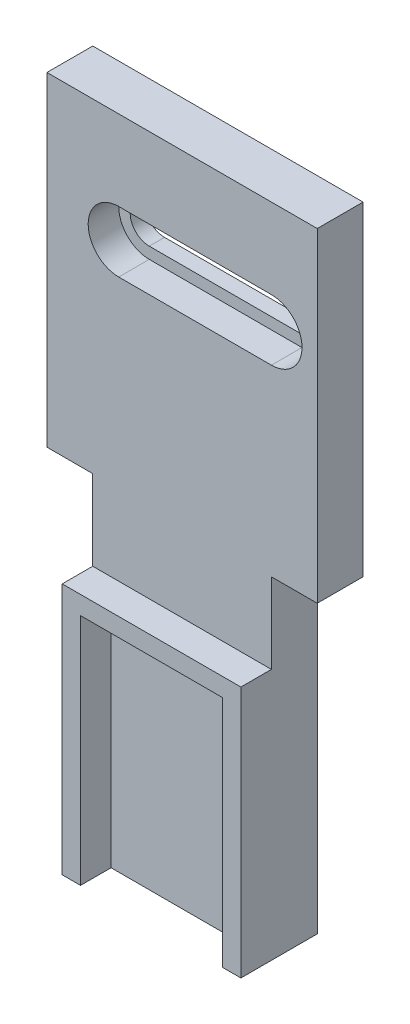
ISO-10303-21;
HEADER;
FILE_DESCRIPTION(('STEP AP214'),'2;1');
FILE_NAME('part.step','',(''),(''),'','','');
FILE_SCHEMA(('AUTOMOTIVE_DESIGN { 1 0 10303 214 1 1 1 1 }'));
ENDSEC;
DATA;
#1=APPLICATION_CONTEXT('core data for automotive mechanical design processes');
#2=APPLICATION_PROTOCOL_DEFINITION('international standard','automotive_design',2000,#1);
#3=PRODUCT_CONTEXT('',#1,'mechanical');
#4=PRODUCT('Part','Part','',(#3));
#5=PRODUCT_RELATED_PRODUCT_CATEGORY('part','',(#4));
#6=PRODUCT_DEFINITION_FORMATION('','',#4);
#7=PRODUCT_DEFINITION_CONTEXT('part definition',#1,'design');
#8=PRODUCT_DEFINITION('design','',#6,#7);
#9=PRODUCT_DEFINITION_SHAPE('','',#8);
#10=(LENGTH_UNIT() NAMED_UNIT(*) SI_UNIT(.MILLI.,.METRE.));
#11=(NAMED_UNIT(*) PLANE_ANGLE_UNIT() SI_UNIT($,.RADIAN.));
#12=(NAMED_UNIT(*) SI_UNIT($,.STERADIAN.) SOLID_ANGLE_UNIT());
#13=UNCERTAINTY_MEASURE_WITH_UNIT(LENGTH_MEASURE(1.E-05),#10,'distance_accuracy_value','');
#14=(GEOMETRIC_REPRESENTATION_CONTEXT(3) GLOBAL_UNCERTAINTY_ASSIGNED_CONTEXT((#13)) GLOBAL_UNIT_ASSIGNED_CONTEXT((#10,
#11,#12)) REPRESENTATION_CONTEXT('',''));
#15=CARTESIAN_POINT('',(0.,0.,0.));
#16=DIRECTION('',(0.,0.,1.));
#17=DIRECTION('',(1.,0.,0.));
#18=AXIS2_PLACEMENT_3D('',#15,#16,#17);
#19=CARTESIAN_POINT('',(-28.7142857142857,26.775974025974,0.));
#20=DIRECTION('',(0.,0.,1.));
#21=DIRECTION('',(1.,0.,0.));
#22=AXIS2_PLACEMENT_3D('',#19,#20,#21);
#23=CYLINDRICAL_SURFACE('',#22,1.25);
#24=CARTESIAN_POINT('',(-28.7142857142857,26.775974025974,1.));
#25=DIRECTION('',(0.,0.,1.));
#26=DIRECTION('',(1.,0.,0.));
#27=AXIS2_PLACEMENT_3D('',#24,#25,#26);
#28=CIRCLE('',#27,1.25);
#29=CARTESIAN_POINT('',(-28.7142857142857,28.025974025974,1.));
#30=VERTEX_POINT('',#29);
#31=CARTESIAN_POINT('',(-28.7142857142857,25.525974025974,1.));
#32=VERTEX_POINT('',#31);
#33=EDGE_CURVE('E279',#30,#32,#28,.F.);
#34=ORIENTED_EDGE('',*,*,#33,.F.);
#35=DIRECTION('',(0.,0.,1.));
#36=VECTOR('',#35,1.);
#37=CARTESIAN_POINT('',(-28.7142857142857,28.025974025974,0.));
#38=LINE('',#37,#36);
#39=CARTESIAN_POINT('',(-28.7142857142857,28.025974025974,0.));
#40=VERTEX_POINT('',#39);
#41=EDGE_CURVE('E293',#40,#30,#38,.T.);
#42=ORIENTED_EDGE('',*,*,#41,.F.);
#43=CARTESIAN_POINT('',(-28.7142857142857,26.775974025974,0.));
#44=DIRECTION('',(0.,0.,1.));
#45=DIRECTION('',(1.,0.,0.));
#46=AXIS2_PLACEMENT_3D('',#43,#44,#45);
#47=CIRCLE('',#46,1.25);
#48=CARTESIAN_POINT('',(-28.7142857142857,25.525974025974,0.));
#49=VERTEX_POINT('',#48);
#50=EDGE_CURVE('E281',#49,#40,#47,.T.);
#51=ORIENTED_EDGE('',*,*,#50,.F.);
#52=DIRECTION('',(0.,0.,1.));
#53=VECTOR('',#52,1.);
#54=CARTESIAN_POINT('',(-28.7142857142857,25.525974025974,0.));
#55=LINE('',#54,#53);
#56=EDGE_CURVE('E294',#49,#32,#55,.T.);
#57=ORIENTED_EDGE('',*,*,#56,.T.);
#58=EDGE_LOOP('',(#34,#42,#51,#57));
#59=FACE_BOUND('',#58,.T.);
#60=ADVANCED_FACE('F38',(#59),#23,.F.);
#61=CARTESIAN_POINT('',(-28.7142857142857,25.525974025974,0.));
#62=DIRECTION('',(0.,-1.,0.));
#63=DIRECTION('',(0.,0.,-1.));
#64=AXIS2_PLACEMENT_3D('',#61,#62,#63);
#65=PLANE('',#64);
#66=DIRECTION('',(-1.,0.,0.));
#67=VECTOR('',#66,1.);
#68=CARTESIAN_POINT('',(-28.7142857142857,25.525974025974,1.));
#69=LINE('',#68,#67);
#70=CARTESIAN_POINT('',(-38.7142857142857,25.525974025974,1.));
#71=VERTEX_POINT('',#70);
#72=EDGE_CURVE('E277',#32,#71,#69,.T.);
#73=ORIENTED_EDGE('',*,*,#72,.F.);
#74=ORIENTED_EDGE('',*,*,#56,.F.);
#75=DIRECTION('',(1.,0.,0.));
#76=VECTOR('',#75,1.);
#77=CARTESIAN_POINT('',(-28.7142857142857,25.525974025974,0.));
#78=LINE('',#77,#76);
#79=CARTESIAN_POINT('',(-38.7142857142857,25.525974025974,0.));
#80=VERTEX_POINT('',#79);
#81=EDGE_CURVE('E290',#80,#49,#78,.T.);
#82=ORIENTED_EDGE('',*,*,#81,.F.);
#83=DIRECTION('',(0.,0.,1.));
#84=VECTOR('',#83,1.);
#85=CARTESIAN_POINT('',(-38.7142857142857,25.525974025974,0.));
#86=LINE('',#85,#84);
#87=EDGE_CURVE('E298',#80,#71,#86,.T.);
#88=ORIENTED_EDGE('',*,*,#87,.T.);
#89=EDGE_LOOP('',(#73,#74,#82,#88));
#90=FACE_BOUND('',#89,.T.);
#91=ADVANCED_FACE('F406',(#90),#65,.F.);
#92=CARTESIAN_POINT('',(-38.7142857142857,26.775974025974,0.));
#93=DIRECTION('',(0.,0.,1.));
#94=DIRECTION('',(1.,0.,0.));
#95=AXIS2_PLACEMENT_3D('',#92,#93,#94);
#96=CYLINDRICAL_SURFACE('',#95,1.25);
#97=CARTESIAN_POINT('',(-38.7142857142857,26.775974025974,1.));
#98=DIRECTION('',(0.,0.,1.));
#99=DIRECTION('',(1.,0.,0.));
#100=AXIS2_PLACEMENT_3D('',#97,#98,#99);
#101=CIRCLE('',#100,1.25);
#102=CARTESIAN_POINT('',(-38.7142857142857,28.025974025974,1.));
#103=VERTEX_POINT('',#102);
#104=EDGE_CURVE('E269',#71,#103,#101,.F.);
#105=ORIENTED_EDGE('',*,*,#104,.F.);
#106=ORIENTED_EDGE('',*,*,#87,.F.);
#107=CARTESIAN_POINT('',(-38.7142857142857,26.775974025974,0.));
#108=DIRECTION('',(0.,0.,1.));
#109=DIRECTION('',(1.,0.,0.));
#110=AXIS2_PLACEMENT_3D('',#107,#108,#109);
#111=CIRCLE('',#110,1.25);
#112=CARTESIAN_POINT('',(-38.7142857142857,28.025974025974,0.));
#113=VERTEX_POINT('',#112);
#114=EDGE_CURVE('E287',#113,#80,#111,.T.);
#115=ORIENTED_EDGE('',*,*,#114,.F.);
#116=DIRECTION('',(0.,0.,1.));
#117=VECTOR('',#116,1.);
#118=CARTESIAN_POINT('',(-38.7142857142857,28.025974025974,0.));
#119=LINE('',#118,#117);
#120=EDGE_CURVE('E301',#113,#103,#119,.T.);
#121=ORIENTED_EDGE('',*,*,#120,.T.);
#122=EDGE_LOOP('',(#105,#106,#115,#121));
#123=FACE_BOUND('',#122,.T.);
#124=ADVANCED_FACE('F411',(#123),#96,.F.);
#125=CARTESIAN_POINT('',(-28.7142857142857,28.025974025974,0.));
#126=DIRECTION('',(0.,1.,0.));
#127=DIRECTION('',(-1.,0.,0.));
#128=AXIS2_PLACEMENT_3D('',#125,#126,#127);
#129=PLANE('',#128);
#130=DIRECTION('',(1.,0.,0.));
#131=VECTOR('',#130,1.);
#132=CARTESIAN_POINT('',(-28.7142857142857,28.025974025974,1.));
#133=LINE('',#132,#131);
#134=EDGE_CURVE('E11',#103,#30,#133,.T.);
#135=ORIENTED_EDGE('',*,*,#134,.F.);
#136=ORIENTED_EDGE('',*,*,#120,.F.);
#137=DIRECTION('',(-1.,0.,0.));
#138=VECTOR('',#137,1.);
#139=CARTESIAN_POINT('',(-28.7142857142857,28.025974025974,0.));
#140=LINE('',#139,#138);
#141=EDGE_CURVE('E284',#40,#113,#140,.T.);
#142=ORIENTED_EDGE('',*,*,#141,.F.);
#143=ORIENTED_EDGE('',*,*,#41,.T.);
#144=EDGE_LOOP('',(#135,#136,#142,#143));
#145=FACE_BOUND('',#144,.T.);
#146=ADVANCED_FACE('F416',(#145),#129,.F.);
#147=CARTESIAN_POINT('',(-43.4142857142857,34.025974025974,3.));
#148=DIRECTION('',(1.,0.,0.));
#149=DIRECTION('',(0.,1.,0.));
#150=AXIS2_PLACEMENT_3D('',#147,#148,#149);
#151=PLANE('',#150);
#152=DIRECTION('',(0.,-1.,0.));
#153=VECTOR('',#152,1.);
#154=CARTESIAN_POINT('',(-43.4142857142857,34.025974025974,0.));
#155=LINE('',#154,#153);
#156=CARTESIAN_POINT('',(-43.4142857142857,34.025974025974,0.));
#157=VERTEX_POINT('',#156);
#158=CARTESIAN_POINT('',(-43.4142857142857,12.775974025974,0.));
#159=VERTEX_POINT('',#158);
#160=EDGE_CURVE('E321',#157,#159,#155,.T.);
#161=ORIENTED_EDGE('',*,*,#160,.T.);
#162=DIRECTION('',(0.,0.,1.));
#163=VECTOR('',#162,1.);
#164=CARTESIAN_POINT('',(-43.4142857142857,12.775974025974,0.));
#165=LINE('',#164,#163);
#166=CARTESIAN_POINT('',(-43.4142857142857,12.775974025974,3.));
#167=VERTEX_POINT('',#166);
#168=EDGE_CURVE('E318',#159,#167,#165,.T.);
#169=ORIENTED_EDGE('',*,*,#168,.T.);
#170=DIRECTION('',(0.,-1.,0.));
#171=VECTOR('',#170,1.);
#172=CARTESIAN_POINT('',(-43.4142857142857,34.025974025974,3.));
#173=LINE('',#172,#171);
#174=CARTESIAN_POINT('',(-43.4142857142857,34.025974025974,3.));
#175=VERTEX_POINT('',#174);
#176=EDGE_CURVE('E342',#175,#167,#173,.T.);
#177=ORIENTED_EDGE('',*,*,#176,.F.);
#178=DIRECTION('',(0.,0.,-1.));
#179=VECTOR('',#178,1.);
#180=CARTESIAN_POINT('',(-43.4142857142857,34.025974025974,3.));
#181=LINE('',#180,#179);
#182=EDGE_CURVE('E350',#175,#157,#181,.T.);
#183=ORIENTED_EDGE('',*,*,#182,.T.);
#184=EDGE_LOOP('',(#161,#169,#177,#183));
#185=FACE_BOUND('',#184,.T.);
#186=ADVANCED_FACE('F40',(#185),#151,.F.);
#187=CARTESIAN_POINT('',(-43.4142857142857,-8.97402597402601,3.));
#188=DIRECTION('',(0.,1.,0.));
#189=DIRECTION('',(0.,0.,1.));
#190=AXIS2_PLACEMENT_3D('',#187,#188,#189);
#191=PLANE('',#190);
#192=DIRECTION('',(1.,0.,0.));
#193=VECTOR('',#192,1.);
#194=CARTESIAN_POINT('',(-39.2142857142857,-8.97402597402601,3.));
#195=LINE('',#194,#193);
#196=CARTESIAN_POINT('',(-39.2142857142857,-8.97402597402601,3.));
#197=VERTEX_POINT('',#196);
#198=CARTESIAN_POINT('',(-29.9142857142857,-8.97402597402601,3.));
#199=VERTEX_POINT('',#198);
#200=EDGE_CURVE('E205',#197,#199,#195,.T.);
#201=ORIENTED_EDGE('',*,*,#200,.F.);
#202=DIRECTION('',(0.,0.,1.));
#203=VECTOR('',#202,1.);
#204=CARTESIAN_POINT('',(-39.2142857142857,-8.97402597402601,3.));
#205=LINE('',#204,#203);
#206=CARTESIAN_POINT('',(-39.2142857142857,-8.97402597402601,5.));
#207=VERTEX_POINT('',#206);
#208=EDGE_CURVE('E188',#197,#207,#205,.T.);
#209=ORIENTED_EDGE('',*,*,#208,.T.);
#210=DIRECTION('',(1.,0.,0.));
#211=VECTOR('',#210,1.);
#212=CARTESIAN_POINT('',(-40.4142857142857,-8.97402597402601,5.));
#213=LINE('',#212,#211);
#214=CARTESIAN_POINT('',(-40.4142857142857,-8.97402597402601,5.));
#215=VERTEX_POINT('',#214);
#216=EDGE_CURVE('E230',#215,#207,#213,.T.);
#217=ORIENTED_EDGE('',*,*,#216,.F.);
#218=DIRECTION('',(0.,0.,1.));
#219=VECTOR('',#218,1.);
#220=CARTESIAN_POINT('',(-40.4142857142857,-8.97402597402601,0.));
#221=LINE('',#220,#219);
#222=CARTESIAN_POINT('',(-40.4142857142857,-8.97402597402601,0.));
#223=VERTEX_POINT('',#222);
#224=EDGE_CURVE('E313',#223,#215,#221,.T.);
#225=ORIENTED_EDGE('',*,*,#224,.F.);
#226=DIRECTION('',(1.,0.,0.));
#227=VECTOR('',#226,1.);
#228=CARTESIAN_POINT('',(-43.4142857142857,-8.97402597402601,0.));
#229=LINE('',#228,#227);
#230=CARTESIAN_POINT('',(-28.7142857142857,-8.97402597402601,0.));
#231=VERTEX_POINT('',#230);
#232=EDGE_CURVE('E353',#223,#231,#229,.T.);
#233=ORIENTED_EDGE('',*,*,#232,.T.);
#234=DIRECTION('',(0.,0.,1.));
#235=VECTOR('',#234,1.);
#236=CARTESIAN_POINT('',(-28.7142857142857,-8.97402597402601,0.));
#237=LINE('',#236,#235);
#238=CARTESIAN_POINT('',(-28.7142857142857,-8.97402597402601,5.));
#239=VERTEX_POINT('',#238);
#240=EDGE_CURVE('E297',#231,#239,#237,.T.);
#241=ORIENTED_EDGE('',*,*,#240,.T.);
#242=CARTESIAN_POINT('',(-29.9142857142857,-8.97402597402601,5.));
#243=VERTEX_POINT('',#242);
#244=EDGE_CURVE('E229',#243,#239,#213,.T.);
#245=ORIENTED_EDGE('',*,*,#244,.F.);
#246=DIRECTION('',(0.,0.,1.));
#247=VECTOR('',#246,1.);
#248=CARTESIAN_POINT('',(-29.9142857142857,-8.97402597402601,3.));
#249=LINE('',#248,#247);
#250=EDGE_CURVE('E53',#199,#243,#249,.T.);
#251=ORIENTED_EDGE('',*,*,#250,.F.);
#252=EDGE_LOOP('',(#201,#209,#217,#225,#233,#241,#245,#251));
#253=FACE_BOUND('',#252,.T.);
#254=ADVANCED_FACE('F209',(#253),#191,.F.);
#255=CARTESIAN_POINT('',(-25.7142857142857,34.025974025974,3.));
#256=DIRECTION('',(-1.,0.,0.));
#257=DIRECTION('',(0.,-1.,0.));
#258=AXIS2_PLACEMENT_3D('',#255,#256,#257);
#259=PLANE('',#258);
#260=DIRECTION('',(0.,1.,0.));
#261=VECTOR('',#260,1.);
#262=CARTESIAN_POINT('',(-25.7142857142857,34.025974025974,3.));
#263=LINE('',#262,#261);
#264=CARTESIAN_POINT('',(-25.7142857142857,12.775974025974,3.));
#265=VERTEX_POINT('',#264);
#266=CARTESIAN_POINT('',(-25.7142857142857,34.025974025974,3.));
#267=VERTEX_POINT('',#266);
#268=EDGE_CURVE('E345',#265,#267,#263,.T.);
#269=ORIENTED_EDGE('',*,*,#268,.F.);
#270=DIRECTION('',(0.,0.,1.));
#271=VECTOR('',#270,1.);
#272=CARTESIAN_POINT('',(-25.7142857142857,12.775974025974,0.));
#273=LINE('',#272,#271);
#274=CARTESIAN_POINT('',(-25.7142857142857,12.775974025974,0.));
#275=VERTEX_POINT('',#274);
#276=EDGE_CURVE('E326',#275,#265,#273,.T.);
#277=ORIENTED_EDGE('',*,*,#276,.F.);
#278=DIRECTION('',(0.,1.,0.));
#279=VECTOR('',#278,1.);
#280=CARTESIAN_POINT('',(-25.7142857142857,34.025974025974,0.));
#281=LINE('',#280,#279);
#282=CARTESIAN_POINT('',(-25.7142857142857,34.025974025974,0.));
#283=VERTEX_POINT('',#282);
#284=EDGE_CURVE('E356',#275,#283,#281,.T.);
#285=ORIENTED_EDGE('',*,*,#284,.T.);
#286=DIRECTION('',(0.,0.,-1.));
#287=VECTOR('',#286,1.);
#288=CARTESIAN_POINT('',(-25.7142857142857,34.025974025974,3.));
#289=LINE('',#288,#287);
#290=EDGE_CURVE('E46',#267,#283,#289,.T.);
#291=ORIENTED_EDGE('',*,*,#290,.F.);
#292=EDGE_LOOP('',(#269,#277,#285,#291));
#293=FACE_BOUND('',#292,.T.);
#294=ADVANCED_FACE('F380',(#293),#259,.F.);
#295=CARTESIAN_POINT('',(-43.4142857142857,34.025974025974,3.));
#296=DIRECTION('',(0.,-1.,0.));
#297=DIRECTION('',(0.,0.,-1.));
#298=AXIS2_PLACEMENT_3D('',#295,#296,#297);
#299=PLANE('',#298);
#300=DIRECTION('',(-1.,0.,0.));
#301=VECTOR('',#300,1.);
#302=CARTESIAN_POINT('',(-43.4142857142857,34.025974025974,0.));
#303=LINE('',#302,#301);
#304=EDGE_CURVE('E346',#283,#157,#303,.T.);
#305=ORIENTED_EDGE('',*,*,#304,.T.);
#306=ORIENTED_EDGE('',*,*,#182,.F.);
#307=DIRECTION('',(-1.,0.,0.));
#308=VECTOR('',#307,1.);
#309=CARTESIAN_POINT('',(-43.4142857142857,34.025974025974,3.));
#310=LINE('',#309,#308);
#311=EDGE_CURVE('E348',#267,#175,#310,.T.);
#312=ORIENTED_EDGE('',*,*,#311,.F.);
#313=ORIENTED_EDGE('',*,*,#290,.T.);
#314=EDGE_LOOP('',(#305,#306,#312,#313));
#315=FACE_BOUND('',#314,.T.);
#316=ADVANCED_FACE('F365',(#315),#299,.F.);
#317=CARTESIAN_POINT('',(0.,0.,3.));
#318=DIRECTION('',(0.,0.,1.));
#319=DIRECTION('',(1.,0.,0.));
#320=AXIS2_PLACEMENT_3D('',#317,#318,#319);
#321=PLANE('',#320);
#322=DIRECTION('',(-1.,0.,0.));
#323=VECTOR('',#322,1.);
#324=CARTESIAN_POINT('',(-40.4142857142857,7.52597402597399,3.));
#325=LINE('',#324,#323);
#326=CARTESIAN_POINT('',(-28.7142857142857,7.52597402597399,3.));
#327=VERTEX_POINT('',#326);
#328=CARTESIAN_POINT('',(-40.4142857142857,7.52597402597399,3.));
#329=VERTEX_POINT('',#328);
#330=EDGE_CURVE('E61',#327,#329,#325,.T.);
#331=ORIENTED_EDGE('',*,*,#330,.F.);
#332=DIRECTION('',(0.,-1.,0.));
#333=VECTOR('',#332,1.);
#334=CARTESIAN_POINT('',(-28.7142857142857,-8.97402597402601,3.));
#335=LINE('',#334,#333);
#336=CARTESIAN_POINT('',(-28.7142857142857,12.775974025974,3.));
#337=VERTEX_POINT('',#336);
#338=EDGE_CURVE('E333',#337,#327,#335,.T.);
#339=ORIENTED_EDGE('',*,*,#338,.F.);
#340=DIRECTION('',(-1.,0.,0.));
#341=VECTOR('',#340,1.);
#342=CARTESIAN_POINT('',(-25.7142857142857,12.775974025974,3.));
#343=LINE('',#342,#341);
#344=EDGE_CURVE('E316',#265,#337,#343,.T.);
#345=ORIENTED_EDGE('',*,*,#344,.F.);
#346=ORIENTED_EDGE('',*,*,#268,.T.);
#347=ORIENTED_EDGE('',*,*,#311,.T.);
#348=ORIENTED_EDGE('',*,*,#176,.T.);
#349=DIRECTION('',(-1.,0.,0.));
#350=VECTOR('',#349,1.);
#351=CARTESIAN_POINT('',(-43.4142857142857,12.775974025974,3.));
#352=LINE('',#351,#350);
#353=CARTESIAN_POINT('',(-40.4142857142857,12.775974025974,3.));
#354=VERTEX_POINT('',#353);
#355=EDGE_CURVE('E310',#354,#167,#352,.T.);
#356=ORIENTED_EDGE('',*,*,#355,.F.);
#357=DIRECTION('',(0.,1.,0.));
#358=VECTOR('',#357,1.);
#359=CARTESIAN_POINT('',(-40.4142857142857,-8.97402597402601,3.));
#360=LINE('',#359,#358);
#361=EDGE_CURVE('E314',#329,#354,#360,.T.);
#362=ORIENTED_EDGE('',*,*,#361,.F.);
#363=EDGE_LOOP('',(#331,#339,#345,#346,#347,#348,#356,#362));
#364=FACE_BOUND('',#363,.T.);
#365=CARTESIAN_POINT('',(-38.7142857142857,26.775974025974,3.));
#366=DIRECTION('',(0.,0.,1.));
#367=DIRECTION('',(1.,0.,0.));
#368=AXIS2_PLACEMENT_3D('',#365,#366,#367);
#369=CIRCLE('',#368,2.);
#370=CARTESIAN_POINT('',(-38.7142857142857,28.775974025974,3.));
#371=VERTEX_POINT('',#370);
#372=CARTESIAN_POINT('',(-38.7142857142857,24.775974025974,3.));
#373=VERTEX_POINT('',#372);
#374=EDGE_CURVE('E243',#371,#373,#369,.T.);
#375=ORIENTED_EDGE('',*,*,#374,.F.);
#376=DIRECTION('',(-1.,0.,0.));
#377=VECTOR('',#376,1.);
#378=CARTESIAN_POINT('',(-38.7142857142857,28.775974025974,3.));
#379=LINE('',#378,#377);
#380=CARTESIAN_POINT('',(-28.7142857142857,28.775974025974,3.));
#381=VERTEX_POINT('',#380);
#382=EDGE_CURVE('E248',#381,#371,#379,.T.);
#383=ORIENTED_EDGE('',*,*,#382,.F.);
#384=CARTESIAN_POINT('',(-28.7142857142857,26.775974025974,3.));
#385=DIRECTION('',(0.,0.,1.));
#386=DIRECTION('',(1.,0.,0.));
#387=AXIS2_PLACEMENT_3D('',#384,#385,#386);
#388=CIRCLE('',#387,2.);
#389=CARTESIAN_POINT('',(-28.7142857142857,24.775974025974,3.));
#390=VERTEX_POINT('',#389);
#391=EDGE_CURVE('E262',#390,#381,#388,.T.);
#392=ORIENTED_EDGE('',*,*,#391,.F.);
#393=DIRECTION('',(1.,0.,0.));
#394=VECTOR('',#393,1.);
#395=CARTESIAN_POINT('',(-38.7142857142857,24.775974025974,3.));
#396=LINE('',#395,#394);
#397=EDGE_CURVE('E259',#373,#390,#396,.T.);
#398=ORIENTED_EDGE('',*,*,#397,.F.);
#399=EDGE_LOOP('',(#375,#383,#392,#398));
#400=FACE_BOUND('',#399,.T.);
#401=ADVANCED_FACE('F376',(#364,#400),#321,.T.);
#402=CARTESIAN_POINT('',(0.,0.,0.));
#403=DIRECTION('',(0.,0.,1.));
#404=DIRECTION('',(1.,0.,0.));
#405=AXIS2_PLACEMENT_3D('',#402,#403,#404);
#406=PLANE('',#405);
#407=ORIENTED_EDGE('',*,*,#81,.T.);
#408=ORIENTED_EDGE('',*,*,#50,.T.);
#409=ORIENTED_EDGE('',*,*,#141,.T.);
#410=ORIENTED_EDGE('',*,*,#114,.T.);
#411=EDGE_LOOP('',(#407,#408,#409,#410));
#412=FACE_BOUND('',#411,.T.);
#413=DIRECTION('',(0.,1.,0.));
#414=VECTOR('',#413,1.);
#415=CARTESIAN_POINT('',(-40.4142857142857,-8.97402597402601,0.));
#416=LINE('',#415,#414);
#417=CARTESIAN_POINT('',(-40.4142857142857,12.775974025974,0.));
#418=VERTEX_POINT('',#417);
#419=EDGE_CURVE('E306',#223,#418,#416,.T.);
#420=ORIENTED_EDGE('',*,*,#419,.T.);
#421=DIRECTION('',(-1.,0.,0.));
#422=VECTOR('',#421,1.);
#423=CARTESIAN_POINT('',(-43.4142857142857,12.775974025974,0.));
#424=LINE('',#423,#422);
#425=EDGE_CURVE('E309',#418,#159,#424,.T.);
#426=ORIENTED_EDGE('',*,*,#425,.T.);
#427=ORIENTED_EDGE('',*,*,#160,.F.);
#428=ORIENTED_EDGE('',*,*,#304,.F.);
#429=ORIENTED_EDGE('',*,*,#284,.F.);
#430=DIRECTION('',(-1.,0.,0.));
#431=VECTOR('',#430,1.);
#432=CARTESIAN_POINT('',(-25.7142857142857,12.775974025974,0.));
#433=LINE('',#432,#431);
#434=CARTESIAN_POINT('',(-28.7142857142857,12.775974025974,0.));
#435=VERTEX_POINT('',#434);
#436=EDGE_CURVE('E335',#275,#435,#433,.T.);
#437=ORIENTED_EDGE('',*,*,#436,.T.);
#438=DIRECTION('',(0.,-1.,0.));
#439=VECTOR('',#438,1.);
#440=CARTESIAN_POINT('',(-28.7142857142857,-8.97402597402601,0.));
#441=LINE('',#440,#439);
#442=EDGE_CURVE('E328',#435,#231,#441,.T.);
#443=ORIENTED_EDGE('',*,*,#442,.T.);
#444=ORIENTED_EDGE('',*,*,#232,.F.);
#445=EDGE_LOOP('',(#420,#426,#427,#428,#429,#437,#443,#444));
#446=FACE_BOUND('',#445,.T.);
#447=ADVANCED_FACE('F372',(#412,#446),#406,.F.);
#448=CARTESIAN_POINT('',(-28.7142857142857,-8.97402597402601,0.));
#449=DIRECTION('',(-1.,0.,0.));
#450=DIRECTION('',(0.,0.,1.));
#451=AXIS2_PLACEMENT_3D('',#448,#449,#450);
#452=PLANE('',#451);
#453=ORIENTED_EDGE('',*,*,#338,.T.);
#454=DIRECTION('',(0.,0.,-1.));
#455=VECTOR('',#454,1.);
#456=CARTESIAN_POINT('',(-28.7142857142857,7.52597402597399,5.));
#457=LINE('',#456,#455);
#458=CARTESIAN_POINT('',(-28.7142857142857,7.52597402597399,5.));
#459=VERTEX_POINT('',#458);
#460=EDGE_CURVE('E240',#459,#327,#457,.T.);
#461=ORIENTED_EDGE('',*,*,#460,.F.);
#462=DIRECTION('',(0.,1.,0.));
#463=VECTOR('',#462,1.);
#464=CARTESIAN_POINT('',(-28.7142857142857,-8.97402597402601,5.));
#465=LINE('',#464,#463);
#466=EDGE_CURVE('E232',#239,#459,#465,.T.);
#467=ORIENTED_EDGE('',*,*,#466,.F.);
#468=ORIENTED_EDGE('',*,*,#240,.F.);
#469=ORIENTED_EDGE('',*,*,#442,.F.);
#470=DIRECTION('',(0.,0.,1.));
#471=VECTOR('',#470,1.);
#472=CARTESIAN_POINT('',(-28.7142857142857,12.775974025974,0.));
#473=LINE('',#472,#471);
#474=EDGE_CURVE('E329',#435,#337,#473,.T.);
#475=ORIENTED_EDGE('',*,*,#474,.T.);
#476=EDGE_LOOP('',(#453,#461,#467,#468,#469,#475));
#477=FACE_BOUND('',#476,.T.);
#478=ADVANCED_FACE('F402',(#477),#452,.F.);
#479=CARTESIAN_POINT('',(-25.7142857142857,12.775974025974,0.));
#480=DIRECTION('',(0.,1.,0.));
#481=DIRECTION('',(0.,0.,1.));
#482=AXIS2_PLACEMENT_3D('',#479,#480,#481);
#483=PLANE('',#482);
#484=ORIENTED_EDGE('',*,*,#344,.T.);
#485=ORIENTED_EDGE('',*,*,#474,.F.);
#486=ORIENTED_EDGE('',*,*,#436,.F.);
#487=ORIENTED_EDGE('',*,*,#276,.T.);
#488=EDGE_LOOP('',(#484,#485,#486,#487));
#489=FACE_BOUND('',#488,.T.);
#490=ADVANCED_FACE('F382',(#489),#483,.F.);
#491=CARTESIAN_POINT('',(-43.4142857142857,12.775974025974,0.));
#492=DIRECTION('',(0.,1.,0.));
#493=DIRECTION('',(0.,0.,1.));
#494=AXIS2_PLACEMENT_3D('',#491,#492,#493);
#495=PLANE('',#494);
#496=ORIENTED_EDGE('',*,*,#355,.T.);
#497=ORIENTED_EDGE('',*,*,#168,.F.);
#498=ORIENTED_EDGE('',*,*,#425,.F.);
#499=DIRECTION('',(0.,0.,1.));
#500=VECTOR('',#499,1.);
#501=CARTESIAN_POINT('',(-40.4142857142857,12.775974025974,0.));
#502=LINE('',#501,#500);
#503=EDGE_CURVE('E322',#418,#354,#502,.T.);
#504=ORIENTED_EDGE('',*,*,#503,.T.);
#505=EDGE_LOOP('',(#496,#497,#498,#504));
#506=FACE_BOUND('',#505,.T.);
#507=ADVANCED_FACE('F393',(#506),#495,.F.);
#508=CARTESIAN_POINT('',(-40.4142857142857,-8.97402597402601,0.));
#509=DIRECTION('',(1.,0.,0.));
#510=DIRECTION('',(0.,0.,-1.));
#511=AXIS2_PLACEMENT_3D('',#508,#509,#510);
#512=PLANE('',#511);
#513=ORIENTED_EDGE('',*,*,#224,.T.);
#514=DIRECTION('',(0.,-1.,0.));
#515=VECTOR('',#514,1.);
#516=CARTESIAN_POINT('',(-40.4142857142857,-8.97402597402601,5.));
#517=LINE('',#516,#515);
#518=CARTESIAN_POINT('',(-40.4142857142857,7.52597402597399,5.));
#519=VERTEX_POINT('',#518);
#520=EDGE_CURVE('E226',#519,#215,#517,.T.);
#521=ORIENTED_EDGE('',*,*,#520,.F.);
#522=DIRECTION('',(0.,0.,-1.));
#523=VECTOR('',#522,1.);
#524=CARTESIAN_POINT('',(-40.4142857142857,7.52597402597399,5.));
#525=LINE('',#524,#523);
#526=EDGE_CURVE('E236',#519,#329,#525,.T.);
#527=ORIENTED_EDGE('',*,*,#526,.T.);
#528=ORIENTED_EDGE('',*,*,#361,.T.);
#529=ORIENTED_EDGE('',*,*,#503,.F.);
#530=ORIENTED_EDGE('',*,*,#419,.F.);
#531=EDGE_LOOP('',(#513,#521,#527,#528,#529,#530));
#532=FACE_BOUND('',#531,.T.);
#533=ADVANCED_FACE('F390',(#532),#512,.F.);
#534=CARTESIAN_POINT('',(-38.7142857142857,26.775974025974,1.));
#535=DIRECTION('',(0.,0.,1.));
#536=DIRECTION('',(1.,0.,0.));
#537=AXIS2_PLACEMENT_3D('',#534,#535,#536);
#538=PLANE('',#537);
#539=CARTESIAN_POINT('',(-38.7142857142857,26.775974025974,1.));
#540=DIRECTION('',(0.,0.,1.));
#541=DIRECTION('',(1.,0.,0.));
#542=AXIS2_PLACEMENT_3D('',#539,#540,#541);
#543=CIRCLE('',#542,2.);
#544=CARTESIAN_POINT('',(-38.7142857142857,28.775974025974,1.));
#545=VERTEX_POINT('',#544);
#546=CARTESIAN_POINT('',(-38.7142857142857,24.775974025974,1.));
#547=VERTEX_POINT('',#546);
#548=EDGE_CURVE('E244',#545,#547,#543,.T.);
#549=ORIENTED_EDGE('',*,*,#548,.T.);
#550=DIRECTION('',(1.,0.,0.));
#551=VECTOR('',#550,1.);
#552=CARTESIAN_POINT('',(-38.7142857142857,24.775974025974,1.));
#553=LINE('',#552,#551);
#554=CARTESIAN_POINT('',(-28.7142857142857,24.775974025974,1.));
#555=VERTEX_POINT('',#554);
#556=EDGE_CURVE('E247',#547,#555,#553,.T.);
#557=ORIENTED_EDGE('',*,*,#556,.T.);
#558=CARTESIAN_POINT('',(-28.7142857142857,26.775974025974,1.));
#559=DIRECTION('',(0.,0.,1.));
#560=DIRECTION('',(1.,0.,0.));
#561=AXIS2_PLACEMENT_3D('',#558,#559,#560);
#562=CIRCLE('',#561,2.);
#563=CARTESIAN_POINT('',(-28.7142857142857,28.775974025974,1.));
#564=VERTEX_POINT('',#563);
#565=EDGE_CURVE('E251',#555,#564,#562,.T.);
#566=ORIENTED_EDGE('',*,*,#565,.T.);
#567=DIRECTION('',(-1.,0.,0.));
#568=VECTOR('',#567,1.);
#569=CARTESIAN_POINT('',(-38.7142857142857,28.775974025974,1.));
#570=LINE('',#569,#568);
#571=EDGE_CURVE('E254',#564,#545,#570,.T.);
#572=ORIENTED_EDGE('',*,*,#571,.T.);
#573=EDGE_LOOP('',(#549,#557,#566,#572));
#574=FACE_BOUND('',#573,.T.);
#575=ORIENTED_EDGE('',*,*,#33,.T.);
#576=ORIENTED_EDGE('',*,*,#72,.T.);
#577=ORIENTED_EDGE('',*,*,#104,.T.);
#578=ORIENTED_EDGE('',*,*,#134,.T.);
#579=EDGE_LOOP('',(#575,#576,#577,#578));
#580=FACE_BOUND('',#579,.T.);
#581=ADVANCED_FACE('F400',(#574,#580),#538,.T.);
#582=CARTESIAN_POINT('',(-38.7142857142857,26.775974025974,1.));
#583=DIRECTION('',(0.,0.,1.));
#584=DIRECTION('',(1.,0.,0.));
#585=AXIS2_PLACEMENT_3D('',#582,#583,#584);
#586=CYLINDRICAL_SURFACE('',#585,2.);
#587=ORIENTED_EDGE('',*,*,#374,.T.);
#588=DIRECTION('',(0.,0.,1.));
#589=VECTOR('',#588,1.);
#590=CARTESIAN_POINT('',(-38.7142857142857,24.775974025974,1.));
#591=LINE('',#590,#589);
#592=EDGE_CURVE('E257',#547,#373,#591,.T.);
#593=ORIENTED_EDGE('',*,*,#592,.F.);
#594=ORIENTED_EDGE('',*,*,#548,.F.);
#595=DIRECTION('',(0.,0.,1.));
#596=VECTOR('',#595,1.);
#597=CARTESIAN_POINT('',(-38.7142857142857,28.775974025974,1.));
#598=LINE('',#597,#596);
#599=EDGE_CURVE('E267',#545,#371,#598,.T.);
#600=ORIENTED_EDGE('',*,*,#599,.T.);
#601=EDGE_LOOP('',(#587,#593,#594,#600));
#602=FACE_BOUND('',#601,.T.);
#603=ADVANCED_FACE('F423',(#602),#586,.F.);
#604=CARTESIAN_POINT('',(-38.7142857142857,28.775974025974,1.));
#605=DIRECTION('',(0.,1.,0.));
#606=DIRECTION('',(0.,0.,1.));
#607=AXIS2_PLACEMENT_3D('',#604,#605,#606);
#608=PLANE('',#607);
#609=ORIENTED_EDGE('',*,*,#382,.T.);
#610=ORIENTED_EDGE('',*,*,#599,.F.);
#611=ORIENTED_EDGE('',*,*,#571,.F.);
#612=DIRECTION('',(0.,0.,1.));
#613=VECTOR('',#612,1.);
#614=CARTESIAN_POINT('',(-28.7142857142857,28.775974025974,1.));
#615=LINE('',#614,#613);
#616=EDGE_CURVE('E270',#564,#381,#615,.T.);
#617=ORIENTED_EDGE('',*,*,#616,.T.);
#618=EDGE_LOOP('',(#609,#610,#611,#617));
#619=FACE_BOUND('',#618,.T.);
#620=ADVANCED_FACE('F426',(#619),#608,.F.);
#621=CARTESIAN_POINT('',(-28.7142857142857,26.775974025974,1.));
#622=DIRECTION('',(0.,0.,1.));
#623=DIRECTION('',(1.,0.,0.));
#624=AXIS2_PLACEMENT_3D('',#621,#622,#623);
#625=CYLINDRICAL_SURFACE('',#624,2.);
#626=ORIENTED_EDGE('',*,*,#391,.T.);
#627=ORIENTED_EDGE('',*,*,#616,.F.);
#628=ORIENTED_EDGE('',*,*,#565,.F.);
#629=DIRECTION('',(0.,0.,1.));
#630=VECTOR('',#629,1.);
#631=CARTESIAN_POINT('',(-28.7142857142857,24.775974025974,1.));
#632=LINE('',#631,#630);
#633=EDGE_CURVE('E272',#555,#390,#632,.T.);
#634=ORIENTED_EDGE('',*,*,#633,.T.);
#635=EDGE_LOOP('',(#626,#627,#628,#634));
#636=FACE_BOUND('',#635,.T.);
#637=ADVANCED_FACE('F432',(#636),#625,.F.);
#638=CARTESIAN_POINT('',(-38.7142857142857,24.775974025974,1.));
#639=DIRECTION('',(0.,-1.,0.));
#640=DIRECTION('',(0.,0.,-1.));
#641=AXIS2_PLACEMENT_3D('',#638,#639,#640);
#642=PLANE('',#641);
#643=ORIENTED_EDGE('',*,*,#397,.T.);
#644=ORIENTED_EDGE('',*,*,#633,.F.);
#645=ORIENTED_EDGE('',*,*,#556,.F.);
#646=ORIENTED_EDGE('',*,*,#592,.T.);
#647=EDGE_LOOP('',(#643,#644,#645,#646));
#648=FACE_BOUND('',#647,.T.);
#649=ADVANCED_FACE('F428',(#648),#642,.F.);
#650=CARTESIAN_POINT('',(-40.4142857142857,7.52597402597399,5.));
#651=DIRECTION('',(0.,-1.,0.));
#652=DIRECTION('',(0.,0.,-1.));
#653=AXIS2_PLACEMENT_3D('',#650,#651,#652);
#654=PLANE('',#653);
#655=ORIENTED_EDGE('',*,*,#330,.T.);
#656=ORIENTED_EDGE('',*,*,#526,.F.);
#657=DIRECTION('',(-1.,0.,0.));
#658=VECTOR('',#657,1.);
#659=CARTESIAN_POINT('',(-40.4142857142857,7.52597402597399,5.));
#660=LINE('',#659,#658);
#661=EDGE_CURVE('E234',#459,#519,#660,.T.);
#662=ORIENTED_EDGE('',*,*,#661,.F.);
#663=ORIENTED_EDGE('',*,*,#460,.T.);
#664=EDGE_LOOP('',(#655,#656,#662,#663));
#665=FACE_BOUND('',#664,.T.);
#666=ADVANCED_FACE('F431',(#665),#654,.F.);
#667=CARTESIAN_POINT('',(0.,0.,5.));
#668=DIRECTION('',(0.,0.,-1.));
#669=DIRECTION('',(-1.,0.,0.));
#670=AXIS2_PLACEMENT_3D('',#667,#668,#669);
#671=PLANE('',#670);
#672=ORIENTED_EDGE('',*,*,#216,.T.);
#673=DIRECTION('',(0.,-1.,0.));
#674=VECTOR('',#673,1.);
#675=CARTESIAN_POINT('',(-39.2142857142857,-8.97402597402601,5.));
#676=LINE('',#675,#674);
#677=CARTESIAN_POINT('',(-39.2142857142857,6.32597402597399,5.));
#678=VERTEX_POINT('',#677);
#679=EDGE_CURVE('E194',#678,#207,#676,.T.);
#680=ORIENTED_EDGE('',*,*,#679,.F.);
#681=DIRECTION('',(-1.,0.,0.));
#682=VECTOR('',#681,1.);
#683=CARTESIAN_POINT('',(-39.2142857142857,6.32597402597399,5.));
#684=LINE('',#683,#682);
#685=CARTESIAN_POINT('',(-29.9142857142857,6.32597402597399,5.));
#686=VERTEX_POINT('',#685);
#687=EDGE_CURVE('E207',#686,#678,#684,.T.);
#688=ORIENTED_EDGE('',*,*,#687,.F.);
#689=DIRECTION('',(0.,1.,0.));
#690=VECTOR('',#689,1.);
#691=CARTESIAN_POINT('',(-29.9142857142857,-8.97402597402601,5.));
#692=LINE('',#691,#690);
#693=EDGE_CURVE('E217',#243,#686,#692,.T.);
#694=ORIENTED_EDGE('',*,*,#693,.F.);
#695=ORIENTED_EDGE('',*,*,#244,.T.);
#696=ORIENTED_EDGE('',*,*,#466,.T.);
#697=ORIENTED_EDGE('',*,*,#661,.T.);
#698=ORIENTED_EDGE('',*,*,#520,.T.);
#699=EDGE_LOOP('',(#672,#680,#688,#694,#695,#696,#697,#698));
#700=FACE_BOUND('',#699,.T.);
#701=ADVANCED_FACE('F445',(#700),#671,.F.);
#702=CARTESIAN_POINT('',(-39.2142857142857,-8.97402597402601,3.));
#703=DIRECTION('',(-1.,0.,0.));
#704=DIRECTION('',(0.,0.,1.));
#705=AXIS2_PLACEMENT_3D('',#702,#703,#704);
#706=PLANE('',#705);
#707=ORIENTED_EDGE('',*,*,#679,.T.);
#708=ORIENTED_EDGE('',*,*,#208,.F.);
#709=DIRECTION('',(0.,-1.,0.));
#710=VECTOR('',#709,1.);
#711=CARTESIAN_POINT('',(-39.2142857142857,-8.97402597402601,3.));
#712=LINE('',#711,#710);
#713=CARTESIAN_POINT('',(-39.2142857142857,6.32597402597399,3.));
#714=VERTEX_POINT('',#713);
#715=EDGE_CURVE('E191',#714,#197,#712,.T.);
#716=ORIENTED_EDGE('',*,*,#715,.F.);
#717=DIRECTION('',(0.,0.,1.));
#718=VECTOR('',#717,1.);
#719=CARTESIAN_POINT('',(-39.2142857142857,6.32597402597399,3.));
#720=LINE('',#719,#718);
#721=EDGE_CURVE('E221',#714,#678,#720,.T.);
#722=ORIENTED_EDGE('',*,*,#721,.T.);
#723=EDGE_LOOP('',(#707,#708,#716,#722));
#724=FACE_BOUND('',#723,.T.);
#725=ADVANCED_FACE('F190',(#724),#706,.F.);
#726=CARTESIAN_POINT('',(-39.2142857142857,6.32597402597399,3.));
#727=DIRECTION('',(0.,1.,0.));
#728=DIRECTION('',(0.,0.,1.));
#729=AXIS2_PLACEMENT_3D('',#726,#727,#728);
#730=PLANE('',#729);
#731=ORIENTED_EDGE('',*,*,#687,.T.);
#732=ORIENTED_EDGE('',*,*,#721,.F.);
#733=DIRECTION('',(-1.,0.,0.));
#734=VECTOR('',#733,1.);
#735=CARTESIAN_POINT('',(-39.2142857142857,6.32597402597399,3.));
#736=LINE('',#735,#734);
#737=CARTESIAN_POINT('',(-29.9142857142857,6.32597402597399,3.));
#738=VERTEX_POINT('',#737);
#739=EDGE_CURVE('E199',#738,#714,#736,.T.);
#740=ORIENTED_EDGE('',*,*,#739,.F.);
#741=DIRECTION('',(0.,0.,1.));
#742=VECTOR('',#741,1.);
#743=CARTESIAN_POINT('',(-29.9142857142857,6.32597402597399,3.));
#744=LINE('',#743,#742);
#745=EDGE_CURVE('E223',#738,#686,#744,.T.);
#746=ORIENTED_EDGE('',*,*,#745,.T.);
#747=EDGE_LOOP('',(#731,#732,#740,#746));
#748=FACE_BOUND('',#747,.T.);
#749=ADVANCED_FACE('F452',(#748),#730,.F.);
#750=CARTESIAN_POINT('',(-29.9142857142857,-8.97402597402601,3.));
#751=DIRECTION('',(1.,0.,0.));
#752=DIRECTION('',(0.,0.,-1.));
#753=AXIS2_PLACEMENT_3D('',#750,#751,#752);
#754=PLANE('',#753);
#755=ORIENTED_EDGE('',*,*,#693,.T.);
#756=ORIENTED_EDGE('',*,*,#745,.F.);
#757=DIRECTION('',(0.,1.,0.));
#758=VECTOR('',#757,1.);
#759=CARTESIAN_POINT('',(-29.9142857142857,-8.97402597402601,3.));
#760=LINE('',#759,#758);
#761=EDGE_CURVE('E211',#199,#738,#760,.T.);
#762=ORIENTED_EDGE('',*,*,#761,.F.);
#763=ORIENTED_EDGE('',*,*,#250,.T.);
#764=EDGE_LOOP('',(#755,#756,#762,#763));
#765=FACE_BOUND('',#764,.T.);
#766=ADVANCED_FACE('F453',(#765),#754,.F.);
#767=CARTESIAN_POINT('',(0.,0.,3.));
#768=DIRECTION('',(0.,0.,-1.));
#769=DIRECTION('',(-1.,0.,0.));
#770=AXIS2_PLACEMENT_3D('',#767,#768,#769);
#771=PLANE('',#770);
#772=ORIENTED_EDGE('',*,*,#715,.T.);
#773=ORIENTED_EDGE('',*,*,#200,.T.);
#774=ORIENTED_EDGE('',*,*,#761,.T.);
#775=ORIENTED_EDGE('',*,*,#739,.T.);
#776=EDGE_LOOP('',(#772,#773,#774,#775));
#777=FACE_BOUND('',#776,.T.);
#778=ADVANCED_FACE('F203',(#777),#771,.F.);
#779=CLOSED_SHELL('',(#60,#91,#124,#146,#186,#254,#294,#316,#401,#447,#478,#490,#507,#533,#581,
#603,#620,#637,#649,#666,#701,#725,#749,#766,#778));
#780=MANIFOLD_SOLID_BREP('B2',#779);
#781=ADVANCED_BREP_SHAPE_REPRESENTATION('',(#18,#780),#14);
#782=SHAPE_DEFINITION_REPRESENTATION(#9,#781);
ENDSEC;
END-ISO-10303-21;
